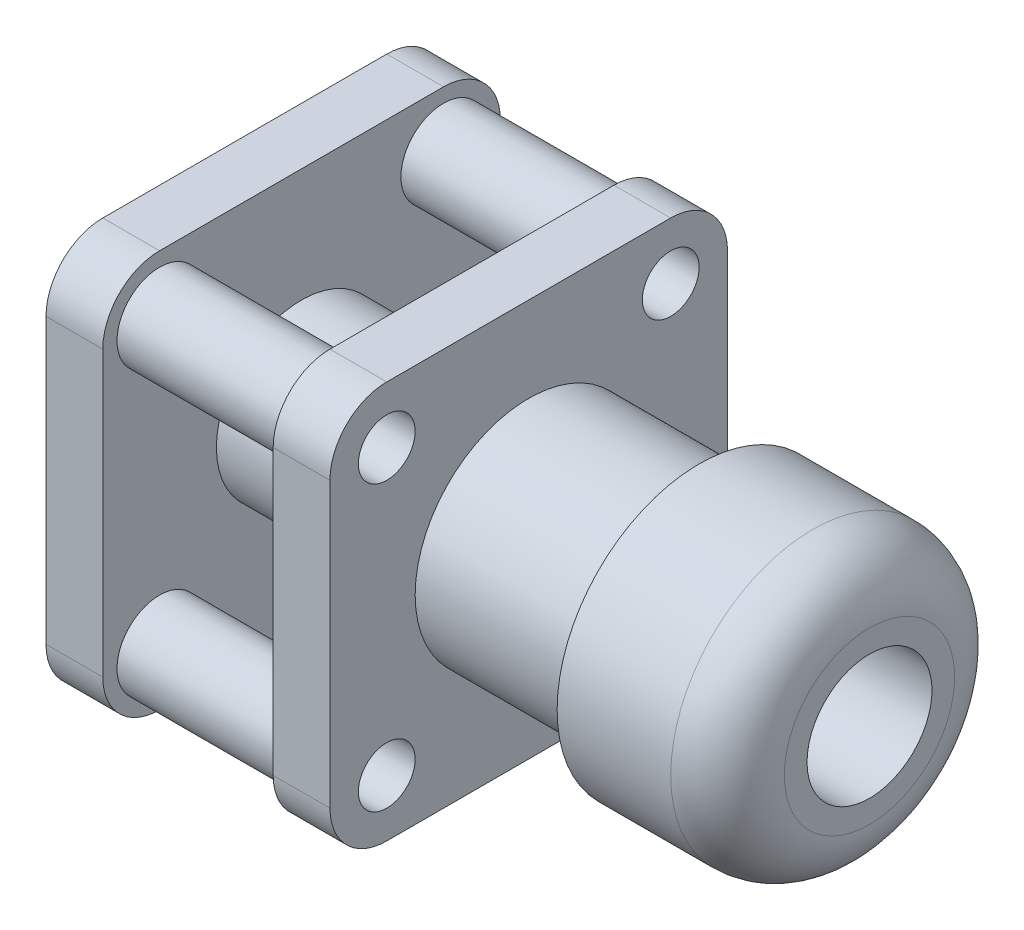
ISO-10303-21;
HEADER;
FILE_DESCRIPTION(('STEP AP214'),'2;1');
FILE_NAME('part.step','',(''),(''),'','','');
FILE_SCHEMA(('AUTOMOTIVE_DESIGN { 1 0 10303 214 1 1 1 1 }'));
ENDSEC;
DATA;
#1=APPLICATION_CONTEXT('core data for automotive mechanical design processes');
#2=APPLICATION_PROTOCOL_DEFINITION('international standard','automotive_design',2000,#1);
#3=PRODUCT_CONTEXT('',#1,'mechanical');
#4=PRODUCT('Part','Part','',(#3));
#5=PRODUCT_RELATED_PRODUCT_CATEGORY('part','',(#4));
#6=PRODUCT_DEFINITION_FORMATION('','',#4);
#7=PRODUCT_DEFINITION_CONTEXT('part definition',#1,'design');
#8=PRODUCT_DEFINITION('design','',#6,#7);
#9=PRODUCT_DEFINITION_SHAPE('','',#8);
#10=(LENGTH_UNIT() NAMED_UNIT(*) SI_UNIT(.MILLI.,.METRE.));
#11=(NAMED_UNIT(*) PLANE_ANGLE_UNIT() SI_UNIT($,.RADIAN.));
#12=(NAMED_UNIT(*) SI_UNIT($,.STERADIAN.) SOLID_ANGLE_UNIT());
#13=UNCERTAINTY_MEASURE_WITH_UNIT(LENGTH_MEASURE(1.E-05),#10,'distance_accuracy_value','');
#14=(GEOMETRIC_REPRESENTATION_CONTEXT(3) GLOBAL_UNCERTAINTY_ASSIGNED_CONTEXT((#13)) GLOBAL_UNIT_ASSIGNED_CONTEXT((#10,
#11,#12)) REPRESENTATION_CONTEXT('',''));
#15=CARTESIAN_POINT('',(0.,0.,0.));
#16=DIRECTION('',(0.,0.,1.));
#17=DIRECTION('',(1.,0.,0.));
#18=AXIS2_PLACEMENT_3D('',#15,#16,#17);
#19=CARTESIAN_POINT('',(6.88338275267597E-12,0.,0.));
#20=DIRECTION('',(-1.,0.,0.));
#21=DIRECTION('',(0.,0.,1.));
#22=AXIS2_PLACEMENT_3D('',#19,#20,#21);
#23=CYLINDRICAL_SURFACE('',#22,11.);
#24=CARTESIAN_POINT('',(110.,0.,0.));
#25=DIRECTION('',(-1.,0.,0.));
#26=DIRECTION('',(0.,0.,1.));
#27=AXIS2_PLACEMENT_3D('',#24,#25,#26);
#28=CIRCLE('',#27,11.);
#29=CARTESIAN_POINT('',(110.,0.,11.));
#30=VERTEX_POINT('',#29);
#31=EDGE_CURVE('E180',#30,#30,#28,.T.);
#32=ORIENTED_EDGE('',*,*,#31,.F.);
#33=EDGE_LOOP('',(#32));
#34=FACE_BOUND('',#33,.T.);
#35=CARTESIAN_POINT('',(0.,0.,0.));
#36=DIRECTION('',(-1.,0.,0.));
#37=DIRECTION('',(0.,0.,1.));
#38=AXIS2_PLACEMENT_3D('',#35,#36,#37);
#39=CIRCLE('',#38,11.);
#40=CARTESIAN_POINT('',(0.,0.,11.));
#41=VERTEX_POINT('',#40);
#42=EDGE_CURVE('E256',#41,#41,#39,.T.);
#43=ORIENTED_EDGE('',*,*,#42,.T.);
#44=EDGE_LOOP('',(#43));
#45=FACE_BOUND('',#44,.T.);
#46=ADVANCED_FACE('F45',(#34,#45),#23,.F.);
#47=CARTESIAN_POINT('',(0.,-11.,0.));
#48=DIRECTION('',(-1.,0.,0.));
#49=DIRECTION('',(0.,0.,1.));
#50=AXIS2_PLACEMENT_3D('',#47,#48,#49);
#51=PLANE('',#50);
#52=ORIENTED_EDGE('',*,*,#42,.F.);
#53=EDGE_LOOP('',(#52));
#54=FACE_BOUND('',#53,.T.);
#55=CARTESIAN_POINT('',(0.,-25.,25.));
#56=DIRECTION('',(-1.,0.,0.));
#57=DIRECTION('',(0.,0.,1.));
#58=AXIS2_PLACEMENT_3D('',#55,#56,#57);
#59=CIRCLE('',#58,5.);
#60=CARTESIAN_POINT('',(0.,-25.,30.));
#61=VERTEX_POINT('',#60);
#62=EDGE_CURVE('E262',#61,#61,#59,.T.);
#63=ORIENTED_EDGE('',*,*,#62,.F.);
#64=EDGE_LOOP('',(#63));
#65=FACE_BOUND('',#64,.T.);
#66=CARTESIAN_POINT('',(0.,25.,25.));
#67=DIRECTION('',(-1.,0.,0.));
#68=DIRECTION('',(0.,0.,1.));
#69=AXIS2_PLACEMENT_3D('',#66,#67,#68);
#70=CIRCLE('',#69,5.);
#71=CARTESIAN_POINT('',(0.,25.,30.));
#72=VERTEX_POINT('',#71);
#73=EDGE_CURVE('E277',#72,#72,#70,.T.);
#74=ORIENTED_EDGE('',*,*,#73,.F.);
#75=EDGE_LOOP('',(#74));
#76=FACE_BOUND('',#75,.T.);
#77=CARTESIAN_POINT('',(0.,25.,-25.));
#78=DIRECTION('',(-1.,0.,0.));
#79=DIRECTION('',(0.,0.,1.));
#80=AXIS2_PLACEMENT_3D('',#77,#78,#79);
#81=CIRCLE('',#80,5.);
#82=CARTESIAN_POINT('',(0.,25.,-20.));
#83=VERTEX_POINT('',#82);
#84=EDGE_CURVE('E281',#83,#83,#81,.T.);
#85=ORIENTED_EDGE('',*,*,#84,.F.);
#86=EDGE_LOOP('',(#85));
#87=FACE_BOUND('',#86,.T.);
#88=CARTESIAN_POINT('',(0.,-25.,-25.));
#89=DIRECTION('',(-1.,0.,0.));
#90=DIRECTION('',(0.,0.,1.));
#91=AXIS2_PLACEMENT_3D('',#88,#89,#90);
#92=CIRCLE('',#91,5.);
#93=CARTESIAN_POINT('',(0.,-25.,-20.));
#94=VERTEX_POINT('',#93);
#95=EDGE_CURVE('E269',#94,#94,#92,.T.);
#96=ORIENTED_EDGE('',*,*,#95,.F.);
#97=EDGE_LOOP('',(#96));
#98=FACE_BOUND('',#97,.T.);
#99=DIRECTION('',(0.,1.,0.));
#100=VECTOR('',#99,1.);
#101=CARTESIAN_POINT('',(0.,24.9999999999999,35.));
#102=LINE('',#101,#100);
#103=CARTESIAN_POINT('',(0.,-24.9999999999999,35.));
#104=VERTEX_POINT('',#103);
#105=CARTESIAN_POINT('',(0.,24.9999999999999,35.));
#106=VERTEX_POINT('',#105);
#107=EDGE_CURVE('E162',#104,#106,#102,.T.);
#108=ORIENTED_EDGE('',*,*,#107,.T.);
#109=CARTESIAN_POINT('',(0.,25.,25.));
#110=DIRECTION('',(-1.,0.,0.));
#111=DIRECTION('',(0.,0.,-1.));
#112=AXIS2_PLACEMENT_3D('',#109,#110,#111);
#113=CIRCLE('',#112,10.);
#114=CARTESIAN_POINT('',(0.,35.,24.9999999999999));
#115=VERTEX_POINT('',#114);
#116=EDGE_CURVE('E165',#106,#115,#113,.T.);
#117=ORIENTED_EDGE('',*,*,#116,.T.);
#118=DIRECTION('',(0.,0.,-1.));
#119=VECTOR('',#118,1.);
#120=CARTESIAN_POINT('',(0.,35.,-24.9999999999999));
#121=LINE('',#120,#119);
#122=CARTESIAN_POINT('',(0.,35.,-24.9999999999999));
#123=VERTEX_POINT('',#122);
#124=EDGE_CURVE('E169',#115,#123,#121,.T.);
#125=ORIENTED_EDGE('',*,*,#124,.T.);
#126=CARTESIAN_POINT('',(0.,25.,-25.));
#127=DIRECTION('',(-1.,0.,0.));
#128=DIRECTION('',(0.,0.,1.));
#129=AXIS2_PLACEMENT_3D('',#126,#127,#128);
#130=CIRCLE('',#129,10.);
#131=CARTESIAN_POINT('',(0.,24.9999999999999,-35.));
#132=VERTEX_POINT('',#131);
#133=EDGE_CURVE('E138',#123,#132,#130,.T.);
#134=ORIENTED_EDGE('',*,*,#133,.T.);
#135=DIRECTION('',(0.,-1.,0.));
#136=VECTOR('',#135,1.);
#137=CARTESIAN_POINT('',(0.,24.9999999999999,-35.));
#138=LINE('',#137,#136);
#139=CARTESIAN_POINT('',(0.,-24.9999999999999,-35.));
#140=VERTEX_POINT('',#139);
#141=EDGE_CURVE('E89',#132,#140,#138,.T.);
#142=ORIENTED_EDGE('',*,*,#141,.T.);
#143=CARTESIAN_POINT('',(0.,-25.,-25.));
#144=DIRECTION('',(-1.,0.,0.));
#145=DIRECTION('',(0.,0.,1.));
#146=AXIS2_PLACEMENT_3D('',#143,#144,#145);
#147=CIRCLE('',#146,10.);
#148=CARTESIAN_POINT('',(0.,-35.,-24.9999999999999));
#149=VERTEX_POINT('',#148);
#150=EDGE_CURVE('E151',#140,#149,#147,.T.);
#151=ORIENTED_EDGE('',*,*,#150,.T.);
#152=DIRECTION('',(0.,0.,1.));
#153=VECTOR('',#152,1.);
#154=CARTESIAN_POINT('',(0.,-35.,-24.9999999999999));
#155=LINE('',#154,#153);
#156=CARTESIAN_POINT('',(0.,-35.,24.9999999999999));
#157=VERTEX_POINT('',#156);
#158=EDGE_CURVE('E154',#149,#157,#155,.T.);
#159=ORIENTED_EDGE('',*,*,#158,.T.);
#160=CARTESIAN_POINT('',(0.,-25.,25.));
#161=DIRECTION('',(-1.,0.,0.));
#162=DIRECTION('',(0.,0.,1.));
#163=AXIS2_PLACEMENT_3D('',#160,#161,#162);
#164=CIRCLE('',#163,10.);
#165=EDGE_CURVE('E158',#157,#104,#164,.T.);
#166=ORIENTED_EDGE('',*,*,#165,.T.);
#167=EDGE_LOOP('',(#108,#117,#125,#134,#142,#151,#159,#166));
#168=FACE_BOUND('',#167,.T.);
#169=ADVANCED_FACE('F245',(#54,#65,#76,#87,#98,#168),#51,.T.);
#170=CARTESIAN_POINT('',(10.,-35.,0.));
#171=DIRECTION('',(1.,0.,0.));
#172=DIRECTION('',(0.,0.,-1.));
#173=AXIS2_PLACEMENT_3D('',#170,#171,#172);
#174=PLANE('',#173);
#175=CARTESIAN_POINT('',(10.,-25.,25.));
#176=DIRECTION('',(-1.,0.,0.));
#177=DIRECTION('',(0.,0.,1.));
#178=AXIS2_PLACEMENT_3D('',#175,#176,#177);
#179=CIRCLE('',#178,7.5);
#180=CARTESIAN_POINT('',(10.,-25.,32.5));
#181=VERTEX_POINT('',#180);
#182=EDGE_CURVE('E377',#181,#181,#179,.T.);
#183=ORIENTED_EDGE('',*,*,#182,.T.);
#184=EDGE_LOOP('',(#183));
#185=FACE_BOUND('',#184,.T.);
#186=CARTESIAN_POINT('',(10.,-25.,-25.));
#187=DIRECTION('',(-1.,0.,0.));
#188=DIRECTION('',(0.,0.,1.));
#189=AXIS2_PLACEMENT_3D('',#186,#187,#188);
#190=CIRCLE('',#189,7.5);
#191=CARTESIAN_POINT('',(10.,-25.,-17.5));
#192=VERTEX_POINT('',#191);
#193=EDGE_CURVE('E408',#192,#192,#190,.T.);
#194=ORIENTED_EDGE('',*,*,#193,.T.);
#195=EDGE_LOOP('',(#194));
#196=FACE_BOUND('',#195,.T.);
#197=CARTESIAN_POINT('',(10.,25.,25.));
#198=DIRECTION('',(-1.,0.,0.));
#199=DIRECTION('',(0.,0.,1.));
#200=AXIS2_PLACEMENT_3D('',#197,#198,#199);
#201=CIRCLE('',#200,7.5);
#202=CARTESIAN_POINT('',(10.,25.,32.5));
#203=VERTEX_POINT('',#202);
#204=EDGE_CURVE('E155',#203,#203,#201,.T.);
#205=ORIENTED_EDGE('',*,*,#204,.T.);
#206=EDGE_LOOP('',(#205));
#207=FACE_BOUND('',#206,.T.);
#208=CARTESIAN_POINT('',(10.,25.,-25.));
#209=DIRECTION('',(-1.,0.,0.));
#210=DIRECTION('',(0.,0.,1.));
#211=AXIS2_PLACEMENT_3D('',#208,#209,#210);
#212=CIRCLE('',#211,7.5);
#213=CARTESIAN_POINT('',(10.,25.,-17.5));
#214=VERTEX_POINT('',#213);
#215=EDGE_CURVE('E412',#214,#214,#212,.T.);
#216=ORIENTED_EDGE('',*,*,#215,.T.);
#217=EDGE_LOOP('',(#216));
#218=FACE_BOUND('',#217,.T.);
#219=CARTESIAN_POINT('',(10.,25.,25.));
#220=DIRECTION('',(-1.,0.,0.));
#221=DIRECTION('',(0.,0.,-1.));
#222=AXIS2_PLACEMENT_3D('',#219,#220,#221);
#223=CIRCLE('',#222,10.);
#224=CARTESIAN_POINT('',(10.,24.9999999999999,35.));
#225=VERTEX_POINT('',#224);
#226=CARTESIAN_POINT('',(10.,35.,24.9999999999999));
#227=VERTEX_POINT('',#226);
#228=EDGE_CURVE('E133',#225,#227,#223,.T.);
#229=ORIENTED_EDGE('',*,*,#228,.F.);
#230=DIRECTION('',(0.,1.,0.));
#231=VECTOR('',#230,1.);
#232=CARTESIAN_POINT('',(10.,24.9999999999999,35.));
#233=LINE('',#232,#231);
#234=CARTESIAN_POINT('',(10.,-24.9999999999999,35.));
#235=VERTEX_POINT('',#234);
#236=EDGE_CURVE('E429',#235,#225,#233,.T.);
#237=ORIENTED_EDGE('',*,*,#236,.F.);
#238=CARTESIAN_POINT('',(10.,-25.,25.));
#239=DIRECTION('',(-1.,0.,0.));
#240=DIRECTION('',(0.,0.,1.));
#241=AXIS2_PLACEMENT_3D('',#238,#239,#240);
#242=CIRCLE('',#241,10.);
#243=CARTESIAN_POINT('',(10.,-35.,24.9999999999999));
#244=VERTEX_POINT('',#243);
#245=EDGE_CURVE('E425',#244,#235,#242,.T.);
#246=ORIENTED_EDGE('',*,*,#245,.F.);
#247=DIRECTION('',(0.,0.,1.));
#248=VECTOR('',#247,1.);
#249=CARTESIAN_POINT('',(10.,-35.,-24.9999999999999));
#250=LINE('',#249,#248);
#251=CARTESIAN_POINT('',(10.,-35.,-24.9999999999999));
#252=VERTEX_POINT('',#251);
#253=EDGE_CURVE('E422',#252,#244,#250,.T.);
#254=ORIENTED_EDGE('',*,*,#253,.F.);
#255=CARTESIAN_POINT('',(10.,-25.,-25.));
#256=DIRECTION('',(-1.,0.,0.));
#257=DIRECTION('',(0.,0.,1.));
#258=AXIS2_PLACEMENT_3D('',#255,#256,#257);
#259=CIRCLE('',#258,10.);
#260=CARTESIAN_POINT('',(10.,-24.9999999999999,-35.));
#261=VERTEX_POINT('',#260);
#262=EDGE_CURVE('E176',#261,#252,#259,.T.);
#263=ORIENTED_EDGE('',*,*,#262,.F.);
#264=DIRECTION('',(0.,-1.,0.));
#265=VECTOR('',#264,1.);
#266=CARTESIAN_POINT('',(10.,24.9999999999999,-35.));
#267=LINE('',#266,#265);
#268=CARTESIAN_POINT('',(10.,24.9999999999999,-35.));
#269=VERTEX_POINT('',#268);
#270=EDGE_CURVE('E62',#269,#261,#267,.T.);
#271=ORIENTED_EDGE('',*,*,#270,.F.);
#272=CARTESIAN_POINT('',(10.,25.,-25.));
#273=DIRECTION('',(-1.,0.,0.));
#274=DIRECTION('',(0.,0.,1.));
#275=AXIS2_PLACEMENT_3D('',#272,#273,#274);
#276=CIRCLE('',#275,10.);
#277=CARTESIAN_POINT('',(10.,35.,-24.9999999999999));
#278=VERTEX_POINT('',#277);
#279=EDGE_CURVE('E132',#278,#269,#276,.T.);
#280=ORIENTED_EDGE('',*,*,#279,.F.);
#281=DIRECTION('',(0.,0.,-1.));
#282=VECTOR('',#281,1.);
#283=CARTESIAN_POINT('',(10.,35.,-24.9999999999999));
#284=LINE('',#283,#282);
#285=EDGE_CURVE('E120',#227,#278,#284,.T.);
#286=ORIENTED_EDGE('',*,*,#285,.F.);
#287=EDGE_LOOP('',(#229,#237,#246,#254,#263,#271,#280,#286));
#288=FACE_BOUND('',#287,.T.);
#289=CARTESIAN_POINT('',(10.,0.,0.));
#290=DIRECTION('',(-1.,0.,0.));
#291=DIRECTION('',(0.,0.,1.));
#292=AXIS2_PLACEMENT_3D('',#289,#290,#291);
#293=CIRCLE('',#292,15.);
#294=CARTESIAN_POINT('',(10.,0.,15.));
#295=VERTEX_POINT('',#294);
#296=EDGE_CURVE('E11',#295,#295,#293,.T.);
#297=ORIENTED_EDGE('',*,*,#296,.T.);
#298=EDGE_LOOP('',(#297));
#299=FACE_BOUND('',#298,.T.);
#300=ADVANCED_FACE('F142',(#185,#196,#207,#218,#288,#299),#174,.T.);
#301=CARTESIAN_POINT('',(6.88338275267597E-12,0.,0.));
#302=DIRECTION('',(-1.,0.,0.));
#303=DIRECTION('',(0.,0.,1.));
#304=AXIS2_PLACEMENT_3D('',#301,#302,#303);
#305=CYLINDRICAL_SURFACE('',#304,15.);
#306=CARTESIAN_POINT('',(40.,0.,0.));
#307=DIRECTION('',(-1.,0.,0.));
#308=DIRECTION('',(0.,0.,1.));
#309=AXIS2_PLACEMENT_3D('',#306,#307,#308);
#310=CIRCLE('',#309,15.);
#311=CARTESIAN_POINT('',(40.,0.,15.));
#312=VERTEX_POINT('',#311);
#313=EDGE_CURVE('E54',#312,#312,#310,.T.);
#314=ORIENTED_EDGE('',*,*,#313,.T.);
#315=EDGE_LOOP('',(#314));
#316=FACE_BOUND('',#315,.T.);
#317=ORIENTED_EDGE('',*,*,#296,.F.);
#318=EDGE_LOOP('',(#317));
#319=FACE_BOUND('',#318,.T.);
#320=ADVANCED_FACE('F224',(#316,#319),#305,.T.);
#321=CARTESIAN_POINT('',(40.,-15.,0.));
#322=DIRECTION('',(-1.,0.,0.));
#323=DIRECTION('',(0.,0.,1.));
#324=AXIS2_PLACEMENT_3D('',#321,#322,#323);
#325=PLANE('',#324);
#326=CARTESIAN_POINT('',(40.,-25.,25.));
#327=DIRECTION('',(-1.,0.,0.));
#328=DIRECTION('',(0.,0.,1.));
#329=AXIS2_PLACEMENT_3D('',#326,#327,#328);
#330=CIRCLE('',#329,7.5);
#331=CARTESIAN_POINT('',(40.,-25.,32.5));
#332=VERTEX_POINT('',#331);
#333=EDGE_CURVE('E289',#332,#332,#330,.T.);
#334=ORIENTED_EDGE('',*,*,#333,.F.);
#335=EDGE_LOOP('',(#334));
#336=FACE_BOUND('',#335,.T.);
#337=CARTESIAN_POINT('',(40.,-25.,-25.));
#338=DIRECTION('',(-1.,0.,0.));
#339=DIRECTION('',(0.,0.,1.));
#340=AXIS2_PLACEMENT_3D('',#337,#338,#339);
#341=CIRCLE('',#340,7.5);
#342=CARTESIAN_POINT('',(40.,-25.,-17.5));
#343=VERTEX_POINT('',#342);
#344=EDGE_CURVE('E296',#343,#343,#341,.T.);
#345=ORIENTED_EDGE('',*,*,#344,.F.);
#346=EDGE_LOOP('',(#345));
#347=FACE_BOUND('',#346,.T.);
#348=CARTESIAN_POINT('',(40.,25.,25.));
#349=DIRECTION('',(-1.,0.,0.));
#350=DIRECTION('',(0.,0.,1.));
#351=AXIS2_PLACEMENT_3D('',#348,#349,#350);
#352=CIRCLE('',#351,7.5);
#353=CARTESIAN_POINT('',(40.,25.,32.5));
#354=VERTEX_POINT('',#353);
#355=EDGE_CURVE('E304',#354,#354,#352,.T.);
#356=ORIENTED_EDGE('',*,*,#355,.F.);
#357=EDGE_LOOP('',(#356));
#358=FACE_BOUND('',#357,.T.);
#359=CARTESIAN_POINT('',(40.,25.,-25.));
#360=DIRECTION('',(-1.,0.,0.));
#361=DIRECTION('',(0.,0.,1.));
#362=AXIS2_PLACEMENT_3D('',#359,#360,#361);
#363=CIRCLE('',#362,7.5);
#364=CARTESIAN_POINT('',(40.,25.,-17.5));
#365=VERTEX_POINT('',#364);
#366=EDGE_CURVE('E300',#365,#365,#363,.T.);
#367=ORIENTED_EDGE('',*,*,#366,.F.);
#368=EDGE_LOOP('',(#367));
#369=FACE_BOUND('',#368,.T.);
#370=DIRECTION('',(0.,1.,0.));
#371=VECTOR('',#370,1.);
#372=CARTESIAN_POINT('',(40.,24.9999999999999,35.));
#373=LINE('',#372,#371);
#374=CARTESIAN_POINT('',(40.,-24.9999999999999,35.));
#375=VERTEX_POINT('',#374);
#376=CARTESIAN_POINT('',(40.,24.9999999999999,35.));
#377=VERTEX_POINT('',#376);
#378=EDGE_CURVE('E354',#375,#377,#373,.T.);
#379=ORIENTED_EDGE('',*,*,#378,.T.);
#380=CARTESIAN_POINT('',(40.,25.,25.));
#381=DIRECTION('',(-1.,0.,0.));
#382=DIRECTION('',(0.,0.,-1.));
#383=AXIS2_PLACEMENT_3D('',#380,#381,#382);
#384=CIRCLE('',#383,10.);
#385=CARTESIAN_POINT('',(40.,35.,24.9999999999999));
#386=VERTEX_POINT('',#385);
#387=EDGE_CURVE('E358',#377,#386,#384,.T.);
#388=ORIENTED_EDGE('',*,*,#387,.T.);
#389=DIRECTION('',(0.,0.,-1.));
#390=VECTOR('',#389,1.);
#391=CARTESIAN_POINT('',(40.,35.,-24.9999999999999));
#392=LINE('',#391,#390);
#393=CARTESIAN_POINT('',(40.,35.,-24.9999999999999));
#394=VERTEX_POINT('',#393);
#395=EDGE_CURVE('E362',#386,#394,#392,.T.);
#396=ORIENTED_EDGE('',*,*,#395,.T.);
#397=CARTESIAN_POINT('',(40.,25.,-25.));
#398=DIRECTION('',(-1.,0.,0.));
#399=DIRECTION('',(0.,0.,1.));
#400=AXIS2_PLACEMENT_3D('',#397,#398,#399);
#401=CIRCLE('',#400,10.);
#402=CARTESIAN_POINT('',(40.,24.9999999999999,-35.));
#403=VERTEX_POINT('',#402);
#404=EDGE_CURVE('E366',#394,#403,#401,.T.);
#405=ORIENTED_EDGE('',*,*,#404,.T.);
#406=DIRECTION('',(0.,-1.,0.));
#407=VECTOR('',#406,1.);
#408=CARTESIAN_POINT('',(40.,24.9999999999999,-35.));
#409=LINE('',#408,#407);
#410=CARTESIAN_POINT('',(40.,-24.9999999999999,-35.));
#411=VERTEX_POINT('',#410);
#412=EDGE_CURVE('E314',#403,#411,#409,.T.);
#413=ORIENTED_EDGE('',*,*,#412,.T.);
#414=CARTESIAN_POINT('',(40.,-25.,-25.));
#415=DIRECTION('',(-1.,0.,0.));
#416=DIRECTION('',(0.,0.,1.));
#417=AXIS2_PLACEMENT_3D('',#414,#415,#416);
#418=CIRCLE('',#417,10.);
#419=CARTESIAN_POINT('',(40.,-35.,-24.9999999999999));
#420=VERTEX_POINT('',#419);
#421=EDGE_CURVE('E308',#411,#420,#418,.T.);
#422=ORIENTED_EDGE('',*,*,#421,.T.);
#423=DIRECTION('',(0.,0.,1.));
#424=VECTOR('',#423,1.);
#425=CARTESIAN_POINT('',(40.,-35.,-24.9999999999999));
#426=LINE('',#425,#424);
#427=CARTESIAN_POINT('',(40.,-35.,24.9999999999999));
#428=VERTEX_POINT('',#427);
#429=EDGE_CURVE('E346',#420,#428,#426,.T.);
#430=ORIENTED_EDGE('',*,*,#429,.T.);
#431=CARTESIAN_POINT('',(40.,-25.,25.));
#432=DIRECTION('',(-1.,0.,0.));
#433=DIRECTION('',(0.,0.,1.));
#434=AXIS2_PLACEMENT_3D('',#431,#432,#433);
#435=CIRCLE('',#434,10.);
#436=EDGE_CURVE('E350',#428,#375,#435,.T.);
#437=ORIENTED_EDGE('',*,*,#436,.T.);
#438=EDGE_LOOP('',(#379,#388,#396,#405,#413,#422,#430,#437));
#439=FACE_BOUND('',#438,.T.);
#440=ORIENTED_EDGE('',*,*,#313,.F.);
#441=EDGE_LOOP('',(#440));
#442=FACE_BOUND('',#441,.T.);
#443=ADVANCED_FACE('F227',(#336,#347,#358,#369,#439,#442),#325,.T.);
#444=CARTESIAN_POINT('',(50.,-35.,0.));
#445=DIRECTION('',(1.,0.,0.));
#446=DIRECTION('',(0.,0.,-1.));
#447=AXIS2_PLACEMENT_3D('',#444,#445,#446);
#448=PLANE('',#447);
#449=CARTESIAN_POINT('',(50.,-25.,25.));
#450=DIRECTION('',(-1.,0.,0.));
#451=DIRECTION('',(0.,0.,1.));
#452=AXIS2_PLACEMENT_3D('',#449,#450,#451);
#453=CIRCLE('',#452,5.);
#454=CARTESIAN_POINT('',(50.,-25.,30.));
#455=VERTEX_POINT('',#454);
#456=EDGE_CURVE('E258',#455,#455,#453,.T.);
#457=ORIENTED_EDGE('',*,*,#456,.T.);
#458=EDGE_LOOP('',(#457));
#459=FACE_BOUND('',#458,.T.);
#460=CARTESIAN_POINT('',(50.,25.,25.));
#461=DIRECTION('',(-1.,0.,0.));
#462=DIRECTION('',(0.,0.,1.));
#463=AXIS2_PLACEMENT_3D('',#460,#461,#462);
#464=CIRCLE('',#463,5.);
#465=CARTESIAN_POINT('',(50.,25.,30.));
#466=VERTEX_POINT('',#465);
#467=EDGE_CURVE('E273',#466,#466,#464,.T.);
#468=ORIENTED_EDGE('',*,*,#467,.T.);
#469=EDGE_LOOP('',(#468));
#470=FACE_BOUND('',#469,.T.);
#471=CARTESIAN_POINT('',(50.,25.,-25.));
#472=DIRECTION('',(-1.,0.,0.));
#473=DIRECTION('',(0.,0.,1.));
#474=AXIS2_PLACEMENT_3D('',#471,#472,#473);
#475=CIRCLE('',#474,5.);
#476=CARTESIAN_POINT('',(50.,25.,-20.));
#477=VERTEX_POINT('',#476);
#478=EDGE_CURVE('E285',#477,#477,#475,.T.);
#479=ORIENTED_EDGE('',*,*,#478,.T.);
#480=EDGE_LOOP('',(#479));
#481=FACE_BOUND('',#480,.T.);
#482=CARTESIAN_POINT('',(50.,-25.,-25.));
#483=DIRECTION('',(-1.,0.,0.));
#484=DIRECTION('',(0.,0.,1.));
#485=AXIS2_PLACEMENT_3D('',#482,#483,#484);
#486=CIRCLE('',#485,5.);
#487=CARTESIAN_POINT('',(50.,-25.,-20.));
#488=VERTEX_POINT('',#487);
#489=EDGE_CURVE('E267',#488,#488,#486,.T.);
#490=ORIENTED_EDGE('',*,*,#489,.T.);
#491=EDGE_LOOP('',(#490));
#492=FACE_BOUND('',#491,.T.);
#493=CARTESIAN_POINT('',(50.,25.,25.));
#494=DIRECTION('',(-1.,0.,0.));
#495=DIRECTION('',(0.,0.,-1.));
#496=AXIS2_PLACEMENT_3D('',#493,#494,#495);
#497=CIRCLE('',#496,10.);
#498=CARTESIAN_POINT('',(50.,24.9999999999999,35.));
#499=VERTEX_POINT('',#498);
#500=CARTESIAN_POINT('',(50.,35.,24.9999999999999));
#501=VERTEX_POINT('',#500);
#502=EDGE_CURVE('E326',#499,#501,#497,.T.);
#503=ORIENTED_EDGE('',*,*,#502,.F.);
#504=DIRECTION('',(0.,1.,0.));
#505=VECTOR('',#504,1.);
#506=CARTESIAN_POINT('',(50.,24.9999999999999,35.));
#507=LINE('',#506,#505);
#508=CARTESIAN_POINT('',(50.,-24.9999999999999,35.));
#509=VERTEX_POINT('',#508);
#510=EDGE_CURVE('E322',#509,#499,#507,.T.);
#511=ORIENTED_EDGE('',*,*,#510,.F.);
#512=CARTESIAN_POINT('',(50.,-25.,25.));
#513=DIRECTION('',(-1.,0.,0.));
#514=DIRECTION('',(0.,0.,1.));
#515=AXIS2_PLACEMENT_3D('',#512,#513,#514);
#516=CIRCLE('',#515,10.);
#517=CARTESIAN_POINT('',(50.,-35.,24.9999999999999));
#518=VERTEX_POINT('',#517);
#519=EDGE_CURVE('E318',#518,#509,#516,.T.);
#520=ORIENTED_EDGE('',*,*,#519,.F.);
#521=DIRECTION('',(0.,0.,1.));
#522=VECTOR('',#521,1.);
#523=CARTESIAN_POINT('',(50.,-35.,-24.9999999999999));
#524=LINE('',#523,#522);
#525=CARTESIAN_POINT('',(50.,-35.,-24.9999999999999));
#526=VERTEX_POINT('',#525);
#527=EDGE_CURVE('E313',#526,#518,#524,.T.);
#528=ORIENTED_EDGE('',*,*,#527,.F.);
#529=CARTESIAN_POINT('',(50.,-25.,-25.));
#530=DIRECTION('',(-1.,0.,0.));
#531=DIRECTION('',(0.,0.,1.));
#532=AXIS2_PLACEMENT_3D('',#529,#530,#531);
#533=CIRCLE('',#532,10.);
#534=CARTESIAN_POINT('',(50.,-24.9999999999999,-35.));
#535=VERTEX_POINT('',#534);
#536=EDGE_CURVE('E309',#535,#526,#533,.T.);
#537=ORIENTED_EDGE('',*,*,#536,.F.);
#538=DIRECTION('',(0.,-1.,0.));
#539=VECTOR('',#538,1.);
#540=CARTESIAN_POINT('',(50.,24.9999999999999,-35.));
#541=LINE('',#540,#539);
#542=CARTESIAN_POINT('',(50.,24.9999999999999,-35.));
#543=VERTEX_POINT('',#542);
#544=EDGE_CURVE('E338',#543,#535,#541,.T.);
#545=ORIENTED_EDGE('',*,*,#544,.F.);
#546=CARTESIAN_POINT('',(50.,25.,-25.));
#547=DIRECTION('',(-1.,0.,0.));
#548=DIRECTION('',(0.,0.,1.));
#549=AXIS2_PLACEMENT_3D('',#546,#547,#548);
#550=CIRCLE('',#549,10.);
#551=CARTESIAN_POINT('',(50.,35.,-24.9999999999999));
#552=VERTEX_POINT('',#551);
#553=EDGE_CURVE('E334',#552,#543,#550,.T.);
#554=ORIENTED_EDGE('',*,*,#553,.F.);
#555=DIRECTION('',(0.,0.,-1.));
#556=VECTOR('',#555,1.);
#557=CARTESIAN_POINT('',(50.,35.,-24.9999999999999));
#558=LINE('',#557,#556);
#559=EDGE_CURVE('E330',#501,#552,#558,.T.);
#560=ORIENTED_EDGE('',*,*,#559,.F.);
#561=EDGE_LOOP('',(#503,#511,#520,#528,#537,#545,#554,#560));
#562=FACE_BOUND('',#561,.T.);
#563=CARTESIAN_POINT('',(50.,0.,0.));
#564=DIRECTION('',(-1.,0.,0.));
#565=DIRECTION('',(0.,0.,1.));
#566=AXIS2_PLACEMENT_3D('',#563,#564,#565);
#567=CIRCLE('',#566,20.);
#568=CARTESIAN_POINT('',(50.,0.,20.));
#569=VERTEX_POINT('',#568);
#570=EDGE_CURVE('E217',#569,#569,#567,.T.);
#571=ORIENTED_EDGE('',*,*,#570,.T.);
#572=EDGE_LOOP('',(#571));
#573=FACE_BOUND('',#572,.T.);
#574=ADVANCED_FACE('F229',(#459,#470,#481,#492,#562,#573),#448,.T.);
#575=CARTESIAN_POINT('',(6.88338275267597E-12,0.,0.));
#576=DIRECTION('',(-1.,0.,0.));
#577=DIRECTION('',(0.,0.,1.));
#578=AXIS2_PLACEMENT_3D('',#575,#576,#577);
#579=CYLINDRICAL_SURFACE('',#578,20.);
#580=CARTESIAN_POINT('',(80.,0.,0.));
#581=DIRECTION('',(-1.,0.,0.));
#582=DIRECTION('',(0.,0.,1.));
#583=AXIS2_PLACEMENT_3D('',#580,#581,#582);
#584=CIRCLE('',#583,20.);
#585=CARTESIAN_POINT('',(80.,0.,20.));
#586=VERTEX_POINT('',#585);
#587=EDGE_CURVE('E213',#586,#586,#584,.T.);
#588=ORIENTED_EDGE('',*,*,#587,.T.);
#589=EDGE_LOOP('',(#588));
#590=FACE_BOUND('',#589,.T.);
#591=ORIENTED_EDGE('',*,*,#570,.F.);
#592=EDGE_LOOP('',(#591));
#593=FACE_BOUND('',#592,.T.);
#594=ADVANCED_FACE('F237',(#590,#593),#579,.T.);
#595=CARTESIAN_POINT('',(80.,-20.,0.));
#596=DIRECTION('',(-1.,0.,0.));
#597=DIRECTION('',(0.,0.,1.));
#598=AXIS2_PLACEMENT_3D('',#595,#596,#597);
#599=PLANE('',#598);
#600=CARTESIAN_POINT('',(80.,0.,0.));
#601=DIRECTION('',(-1.,0.,0.));
#602=DIRECTION('',(0.,0.,1.));
#603=AXIS2_PLACEMENT_3D('',#600,#601,#602);
#604=CIRCLE('',#603,25.);
#605=CARTESIAN_POINT('',(80.,0.,25.));
#606=VERTEX_POINT('',#605);
#607=EDGE_CURVE('E209',#606,#606,#604,.T.);
#608=ORIENTED_EDGE('',*,*,#607,.T.);
#609=EDGE_LOOP('',(#608));
#610=FACE_BOUND('',#609,.T.);
#611=ORIENTED_EDGE('',*,*,#587,.F.);
#612=EDGE_LOOP('',(#611));
#613=FACE_BOUND('',#612,.T.);
#614=ADVANCED_FACE('F488',(#610,#613),#599,.T.);
#615=CARTESIAN_POINT('',(6.88338275267597E-12,0.,0.));
#616=DIRECTION('',(-1.,0.,0.));
#617=DIRECTION('',(0.,0.,1.));
#618=AXIS2_PLACEMENT_3D('',#615,#616,#617);
#619=CYLINDRICAL_SURFACE('',#618,25.);
#620=CARTESIAN_POINT('',(99.9999999999999,0.,0.));
#621=DIRECTION('',(-1.,0.,0.));
#622=DIRECTION('',(0.,0.,1.));
#623=AXIS2_PLACEMENT_3D('',#620,#621,#622);
#624=CIRCLE('',#623,25.);
#625=CARTESIAN_POINT('',(99.9999999999999,0.,25.));
#626=VERTEX_POINT('',#625);
#627=EDGE_CURVE('E205',#626,#626,#624,.T.);
#628=ORIENTED_EDGE('',*,*,#627,.T.);
#629=EDGE_LOOP('',(#628));
#630=FACE_BOUND('',#629,.T.);
#631=ORIENTED_EDGE('',*,*,#607,.F.);
#632=EDGE_LOOP('',(#631));
#633=FACE_BOUND('',#632,.T.);
#634=ADVANCED_FACE('F484',(#630,#633),#619,.T.);
#635=CARTESIAN_POINT('',(100.,0.,0.));
#636=DIRECTION('',(-1.,0.,0.));
#637=DIRECTION('',(0.,0.,1.));
#638=AXIS2_PLACEMENT_3D('',#635,#636,#637);
#639=TOROIDAL_SURFACE('',#638,15.,10.);
#640=CARTESIAN_POINT('',(110.,0.,0.));
#641=DIRECTION('',(-1.,0.,0.));
#642=DIRECTION('',(0.,0.,1.));
#643=AXIS2_PLACEMENT_3D('',#640,#641,#642);
#644=CIRCLE('',#643,15.);
#645=CARTESIAN_POINT('',(110.,0.,15.));
#646=VERTEX_POINT('',#645);
#647=EDGE_CURVE('E201',#646,#646,#644,.T.);
#648=ORIENTED_EDGE('',*,*,#647,.T.);
#649=EDGE_LOOP('',(#648));
#650=FACE_BOUND('',#649,.T.);
#651=ORIENTED_EDGE('',*,*,#627,.F.);
#652=EDGE_LOOP('',(#651));
#653=FACE_BOUND('',#652,.T.);
#654=ADVANCED_FACE('F480',(#650,#653),#639,.T.);
#655=CARTESIAN_POINT('',(110.,-14.9999999999999,0.));
#656=DIRECTION('',(1.,0.,0.));
#657=DIRECTION('',(0.,0.,-1.));
#658=AXIS2_PLACEMENT_3D('',#655,#656,#657);
#659=PLANE('',#658);
#660=ORIENTED_EDGE('',*,*,#31,.T.);
#661=EDGE_LOOP('',(#660));
#662=FACE_BOUND('',#661,.T.);
#663=ORIENTED_EDGE('',*,*,#647,.F.);
#664=EDGE_LOOP('',(#663));
#665=FACE_BOUND('',#664,.T.);
#666=ADVANCED_FACE('F473',(#662,#665),#659,.T.);
#667=CARTESIAN_POINT('',(10.,-25.,25.));
#668=DIRECTION('',(-1.,0.,0.));
#669=DIRECTION('',(0.,0.,1.));
#670=AXIS2_PLACEMENT_3D('',#667,#668,#669);
#671=CYLINDRICAL_SURFACE('',#670,10.);
#672=ORIENTED_EDGE('',*,*,#165,.F.);
#673=DIRECTION('',(-1.,0.,0.));
#674=VECTOR('',#673,1.);
#675=CARTESIAN_POINT('',(10.,-35.,24.9999999999999));
#676=LINE('',#675,#674);
#677=EDGE_CURVE('E192',#244,#157,#676,.T.);
#678=ORIENTED_EDGE('',*,*,#677,.F.);
#679=ORIENTED_EDGE('',*,*,#245,.T.);
#680=DIRECTION('',(-1.,0.,0.));
#681=VECTOR('',#680,1.);
#682=CARTESIAN_POINT('',(10.,-24.9999999999999,35.));
#683=LINE('',#682,#681);
#684=EDGE_CURVE('E189',#235,#104,#683,.T.);
#685=ORIENTED_EDGE('',*,*,#684,.T.);
#686=EDGE_LOOP('',(#672,#678,#679,#685));
#687=FACE_BOUND('',#686,.T.);
#688=ADVANCED_FACE('F442',(#687),#671,.T.);
#689=CARTESIAN_POINT('',(10.,25.,25.));
#690=DIRECTION('',(-1.,0.,0.));
#691=DIRECTION('',(0.,0.,1.));
#692=AXIS2_PLACEMENT_3D('',#689,#690,#691);
#693=CYLINDRICAL_SURFACE('',#692,10.);
#694=ORIENTED_EDGE('',*,*,#116,.F.);
#695=DIRECTION('',(-1.,0.,0.));
#696=VECTOR('',#695,1.);
#697=CARTESIAN_POINT('',(10.,24.9999999999999,35.));
#698=LINE('',#697,#696);
#699=EDGE_CURVE('E185',#225,#106,#698,.T.);
#700=ORIENTED_EDGE('',*,*,#699,.F.);
#701=ORIENTED_EDGE('',*,*,#228,.T.);
#702=DIRECTION('',(-1.,0.,0.));
#703=VECTOR('',#702,1.);
#704=CARTESIAN_POINT('',(10.,35.,24.9999999999999));
#705=LINE('',#704,#703);
#706=EDGE_CURVE('E126',#227,#115,#705,.T.);
#707=ORIENTED_EDGE('',*,*,#706,.T.);
#708=EDGE_LOOP('',(#694,#700,#701,#707));
#709=FACE_BOUND('',#708,.T.);
#710=ADVANCED_FACE('F435',(#709),#693,.T.);
#711=CARTESIAN_POINT('',(10.,25.,-25.));
#712=DIRECTION('',(-1.,0.,0.));
#713=DIRECTION('',(0.,0.,1.));
#714=AXIS2_PLACEMENT_3D('',#711,#712,#713);
#715=CYLINDRICAL_SURFACE('',#714,10.);
#716=ORIENTED_EDGE('',*,*,#133,.F.);
#717=DIRECTION('',(-1.,0.,0.));
#718=VECTOR('',#717,1.);
#719=CARTESIAN_POINT('',(10.,35.,-24.9999999999999));
#720=LINE('',#719,#718);
#721=EDGE_CURVE('E123',#278,#123,#720,.T.);
#722=ORIENTED_EDGE('',*,*,#721,.F.);
#723=ORIENTED_EDGE('',*,*,#279,.T.);
#724=DIRECTION('',(-1.,0.,0.));
#725=VECTOR('',#724,1.);
#726=CARTESIAN_POINT('',(10.,24.9999999999999,-35.));
#727=LINE('',#726,#725);
#728=EDGE_CURVE('E140',#269,#132,#727,.T.);
#729=ORIENTED_EDGE('',*,*,#728,.T.);
#730=EDGE_LOOP('',(#716,#722,#723,#729));
#731=FACE_BOUND('',#730,.T.);
#732=ADVANCED_FACE('F137',(#731),#715,.T.);
#733=CARTESIAN_POINT('',(10.,-25.,-25.));
#734=DIRECTION('',(-1.,0.,0.));
#735=DIRECTION('',(0.,0.,1.));
#736=AXIS2_PLACEMENT_3D('',#733,#734,#735);
#737=CYLINDRICAL_SURFACE('',#736,10.);
#738=ORIENTED_EDGE('',*,*,#150,.F.);
#739=DIRECTION('',(-1.,0.,0.));
#740=VECTOR('',#739,1.);
#741=CARTESIAN_POINT('',(10.,-24.9999999999999,-35.));
#742=LINE('',#741,#740);
#743=EDGE_CURVE('E177',#261,#140,#742,.T.);
#744=ORIENTED_EDGE('',*,*,#743,.F.);
#745=ORIENTED_EDGE('',*,*,#262,.T.);
#746=DIRECTION('',(-1.,0.,0.));
#747=VECTOR('',#746,1.);
#748=CARTESIAN_POINT('',(10.,-35.,-24.9999999999999));
#749=LINE('',#748,#747);
#750=EDGE_CURVE('E101',#252,#149,#749,.T.);
#751=ORIENTED_EDGE('',*,*,#750,.T.);
#752=EDGE_LOOP('',(#738,#744,#745,#751));
#753=FACE_BOUND('',#752,.T.);
#754=ADVANCED_FACE('F447',(#753),#737,.T.);
#755=CARTESIAN_POINT('',(10.,-35.,-24.9999999999999));
#756=DIRECTION('',(0.,-1.,0.));
#757=DIRECTION('',(0.,0.,-1.));
#758=AXIS2_PLACEMENT_3D('',#755,#756,#757);
#759=PLANE('',#758);
#760=ORIENTED_EDGE('',*,*,#253,.T.);
#761=ORIENTED_EDGE('',*,*,#677,.T.);
#762=ORIENTED_EDGE('',*,*,#158,.F.);
#763=ORIENTED_EDGE('',*,*,#750,.F.);
#764=EDGE_LOOP('',(#760,#761,#762,#763));
#765=FACE_BOUND('',#764,.T.);
#766=ADVANCED_FACE('F444',(#765),#759,.T.);
#767=CARTESIAN_POINT('',(10.,24.9999999999999,35.));
#768=DIRECTION('',(0.,0.,1.));
#769=DIRECTION('',(0.,-1.,0.));
#770=AXIS2_PLACEMENT_3D('',#767,#768,#769);
#771=PLANE('',#770);
#772=ORIENTED_EDGE('',*,*,#236,.T.);
#773=ORIENTED_EDGE('',*,*,#699,.T.);
#774=ORIENTED_EDGE('',*,*,#107,.F.);
#775=ORIENTED_EDGE('',*,*,#684,.F.);
#776=EDGE_LOOP('',(#772,#773,#774,#775));
#777=FACE_BOUND('',#776,.T.);
#778=ADVANCED_FACE('F459',(#777),#771,.T.);
#779=CARTESIAN_POINT('',(10.,35.,-24.9999999999999));
#780=DIRECTION('',(0.,1.,0.));
#781=DIRECTION('',(0.,0.,1.));
#782=AXIS2_PLACEMENT_3D('',#779,#780,#781);
#783=PLANE('',#782);
#784=ORIENTED_EDGE('',*,*,#285,.T.);
#785=ORIENTED_EDGE('',*,*,#721,.T.);
#786=ORIENTED_EDGE('',*,*,#124,.F.);
#787=ORIENTED_EDGE('',*,*,#706,.F.);
#788=EDGE_LOOP('',(#784,#785,#786,#787));
#789=FACE_BOUND('',#788,.T.);
#790=ADVANCED_FACE('F122',(#789),#783,.T.);
#791=CARTESIAN_POINT('',(10.,24.9999999999999,-35.));
#792=DIRECTION('',(0.,0.,-1.));
#793=DIRECTION('',(-1.,0.,0.));
#794=AXIS2_PLACEMENT_3D('',#791,#792,#793);
#795=PLANE('',#794);
#796=ORIENTED_EDGE('',*,*,#270,.T.);
#797=ORIENTED_EDGE('',*,*,#743,.T.);
#798=ORIENTED_EDGE('',*,*,#141,.F.);
#799=ORIENTED_EDGE('',*,*,#728,.F.);
#800=EDGE_LOOP('',(#796,#797,#798,#799));
#801=FACE_BOUND('',#800,.T.);
#802=ADVANCED_FACE('F448',(#801),#795,.T.);
#803=CARTESIAN_POINT('',(50.,-25.,25.));
#804=DIRECTION('',(-1.,0.,0.));
#805=DIRECTION('',(0.,0.,1.));
#806=AXIS2_PLACEMENT_3D('',#803,#804,#805);
#807=CYLINDRICAL_SURFACE('',#806,10.);
#808=ORIENTED_EDGE('',*,*,#436,.F.);
#809=DIRECTION('',(-1.,0.,0.));
#810=VECTOR('',#809,1.);
#811=CARTESIAN_POINT('',(50.,-35.,24.9999999999999));
#812=LINE('',#811,#810);
#813=EDGE_CURVE('E398',#518,#428,#812,.T.);
#814=ORIENTED_EDGE('',*,*,#813,.F.);
#815=ORIENTED_EDGE('',*,*,#519,.T.);
#816=DIRECTION('',(-1.,0.,0.));
#817=VECTOR('',#816,1.);
#818=CARTESIAN_POINT('',(50.,-24.9999999999999,35.));
#819=LINE('',#818,#817);
#820=EDGE_CURVE('E394',#509,#375,#819,.T.);
#821=ORIENTED_EDGE('',*,*,#820,.T.);
#822=EDGE_LOOP('',(#808,#814,#815,#821));
#823=FACE_BOUND('',#822,.T.);
#824=ADVANCED_FACE('F450',(#823),#807,.T.);
#825=CARTESIAN_POINT('',(50.,25.,25.));
#826=DIRECTION('',(-1.,0.,0.));
#827=DIRECTION('',(0.,0.,1.));
#828=AXIS2_PLACEMENT_3D('',#825,#826,#827);
#829=CYLINDRICAL_SURFACE('',#828,10.);
#830=ORIENTED_EDGE('',*,*,#387,.F.);
#831=DIRECTION('',(-1.,0.,0.));
#832=VECTOR('',#831,1.);
#833=CARTESIAN_POINT('',(50.,24.9999999999999,35.));
#834=LINE('',#833,#832);
#835=EDGE_CURVE('E390',#499,#377,#834,.T.);
#836=ORIENTED_EDGE('',*,*,#835,.F.);
#837=ORIENTED_EDGE('',*,*,#502,.T.);
#838=DIRECTION('',(-1.,0.,0.));
#839=VECTOR('',#838,1.);
#840=CARTESIAN_POINT('',(50.,35.,24.9999999999999));
#841=LINE('',#840,#839);
#842=EDGE_CURVE('E386',#501,#386,#841,.T.);
#843=ORIENTED_EDGE('',*,*,#842,.T.);
#844=EDGE_LOOP('',(#830,#836,#837,#843));
#845=FACE_BOUND('',#844,.T.);
#846=ADVANCED_FACE('F456',(#845),#829,.T.);
#847=CARTESIAN_POINT('',(50.,25.,-25.));
#848=DIRECTION('',(-1.,0.,0.));
#849=DIRECTION('',(0.,0.,1.));
#850=AXIS2_PLACEMENT_3D('',#847,#848,#849);
#851=CYLINDRICAL_SURFACE('',#850,10.);
#852=ORIENTED_EDGE('',*,*,#404,.F.);
#853=DIRECTION('',(-1.,0.,0.));
#854=VECTOR('',#853,1.);
#855=CARTESIAN_POINT('',(50.,35.,-24.9999999999999));
#856=LINE('',#855,#854);
#857=EDGE_CURVE('E382',#552,#394,#856,.T.);
#858=ORIENTED_EDGE('',*,*,#857,.F.);
#859=ORIENTED_EDGE('',*,*,#553,.T.);
#860=DIRECTION('',(-1.,0.,0.));
#861=VECTOR('',#860,1.);
#862=CARTESIAN_POINT('',(50.,24.9999999999999,-35.));
#863=LINE('',#862,#861);
#864=EDGE_CURVE('E378',#543,#403,#863,.T.);
#865=ORIENTED_EDGE('',*,*,#864,.T.);
#866=EDGE_LOOP('',(#852,#858,#859,#865));
#867=FACE_BOUND('',#866,.T.);
#868=ADVANCED_FACE('F604',(#867),#851,.T.);
#869=CARTESIAN_POINT('',(50.,-25.,-25.));
#870=DIRECTION('',(-1.,0.,0.));
#871=DIRECTION('',(0.,0.,1.));
#872=AXIS2_PLACEMENT_3D('',#869,#870,#871);
#873=CYLINDRICAL_SURFACE('',#872,10.);
#874=ORIENTED_EDGE('',*,*,#421,.F.);
#875=DIRECTION('',(-1.,0.,0.));
#876=VECTOR('',#875,1.);
#877=CARTESIAN_POINT('',(50.,-24.9999999999999,-35.));
#878=LINE('',#877,#876);
#879=EDGE_CURVE('E373',#535,#411,#878,.T.);
#880=ORIENTED_EDGE('',*,*,#879,.F.);
#881=ORIENTED_EDGE('',*,*,#536,.T.);
#882=DIRECTION('',(-1.,0.,0.));
#883=VECTOR('',#882,1.);
#884=CARTESIAN_POINT('',(50.,-35.,-24.9999999999999));
#885=LINE('',#884,#883);
#886=EDGE_CURVE('E342',#526,#420,#885,.T.);
#887=ORIENTED_EDGE('',*,*,#886,.T.);
#888=EDGE_LOOP('',(#874,#880,#881,#887));
#889=FACE_BOUND('',#888,.T.);
#890=ADVANCED_FACE('F463',(#889),#873,.T.);
#891=CARTESIAN_POINT('',(50.,-35.,-24.9999999999999));
#892=DIRECTION('',(0.,-1.,0.));
#893=DIRECTION('',(0.,0.,-1.));
#894=AXIS2_PLACEMENT_3D('',#891,#892,#893);
#895=PLANE('',#894);
#896=ORIENTED_EDGE('',*,*,#527,.T.);
#897=ORIENTED_EDGE('',*,*,#813,.T.);
#898=ORIENTED_EDGE('',*,*,#429,.F.);
#899=ORIENTED_EDGE('',*,*,#886,.F.);
#900=EDGE_LOOP('',(#896,#897,#898,#899));
#901=FACE_BOUND('',#900,.T.);
#902=ADVANCED_FACE('F623',(#901),#895,.T.);
#903=CARTESIAN_POINT('',(50.,24.9999999999999,35.));
#904=DIRECTION('',(0.,0.,1.));
#905=DIRECTION('',(0.,-1.,0.));
#906=AXIS2_PLACEMENT_3D('',#903,#904,#905);
#907=PLANE('',#906);
#908=ORIENTED_EDGE('',*,*,#510,.T.);
#909=ORIENTED_EDGE('',*,*,#835,.T.);
#910=ORIENTED_EDGE('',*,*,#378,.F.);
#911=ORIENTED_EDGE('',*,*,#820,.F.);
#912=EDGE_LOOP('',(#908,#909,#910,#911));
#913=FACE_BOUND('',#912,.T.);
#914=ADVANCED_FACE('F632',(#913),#907,.T.);
#915=CARTESIAN_POINT('',(50.,35.,-24.9999999999999));
#916=DIRECTION('',(0.,1.,0.));
#917=DIRECTION('',(0.,0.,1.));
#918=AXIS2_PLACEMENT_3D('',#915,#916,#917);
#919=PLANE('',#918);
#920=ORIENTED_EDGE('',*,*,#559,.T.);
#921=ORIENTED_EDGE('',*,*,#857,.T.);
#922=ORIENTED_EDGE('',*,*,#395,.F.);
#923=ORIENTED_EDGE('',*,*,#842,.F.);
#924=EDGE_LOOP('',(#920,#921,#922,#923));
#925=FACE_BOUND('',#924,.T.);
#926=ADVANCED_FACE('F641',(#925),#919,.T.);
#927=CARTESIAN_POINT('',(50.,24.9999999999999,-35.));
#928=DIRECTION('',(0.,0.,-1.));
#929=DIRECTION('',(-1.,0.,0.));
#930=AXIS2_PLACEMENT_3D('',#927,#928,#929);
#931=PLANE('',#930);
#932=ORIENTED_EDGE('',*,*,#544,.T.);
#933=ORIENTED_EDGE('',*,*,#879,.T.);
#934=ORIENTED_EDGE('',*,*,#412,.F.);
#935=ORIENTED_EDGE('',*,*,#864,.F.);
#936=EDGE_LOOP('',(#932,#933,#934,#935));
#937=FACE_BOUND('',#936,.T.);
#938=ADVANCED_FACE('F651',(#937),#931,.T.);
#939=CARTESIAN_POINT('',(50.,25.,-25.));
#940=DIRECTION('',(-1.,0.,0.));
#941=DIRECTION('',(0.,0.,1.));
#942=AXIS2_PLACEMENT_3D('',#939,#940,#941);
#943=CYLINDRICAL_SURFACE('',#942,5.);
#944=ORIENTED_EDGE('',*,*,#478,.F.);
#945=EDGE_LOOP('',(#944));
#946=FACE_BOUND('',#945,.T.);
#947=ORIENTED_EDGE('',*,*,#84,.T.);
#948=EDGE_LOOP('',(#947));
#949=FACE_BOUND('',#948,.T.);
#950=ADVANCED_FACE('F661',(#946,#949),#943,.F.);
#951=CARTESIAN_POINT('',(50.,25.,-25.));
#952=DIRECTION('',(-1.,0.,0.));
#953=DIRECTION('',(0.,0.,1.));
#954=AXIS2_PLACEMENT_3D('',#951,#952,#953);
#955=CYLINDRICAL_SURFACE('',#954,7.5);
#956=ORIENTED_EDGE('',*,*,#215,.F.);
#957=EDGE_LOOP('',(#956));
#958=FACE_BOUND('',#957,.T.);
#959=ORIENTED_EDGE('',*,*,#366,.T.);
#960=EDGE_LOOP('',(#959));
#961=FACE_BOUND('',#960,.T.);
#962=ADVANCED_FACE('F691',(#958,#961),#955,.T.);
#963=CARTESIAN_POINT('',(50.,25.,25.));
#964=DIRECTION('',(-1.,0.,0.));
#965=DIRECTION('',(0.,0.,1.));
#966=AXIS2_PLACEMENT_3D('',#963,#964,#965);
#967=CYLINDRICAL_SURFACE('',#966,5.);
#968=ORIENTED_EDGE('',*,*,#467,.F.);
#969=EDGE_LOOP('',(#968));
#970=FACE_BOUND('',#969,.T.);
#971=ORIENTED_EDGE('',*,*,#73,.T.);
#972=EDGE_LOOP('',(#971));
#973=FACE_BOUND('',#972,.T.);
#974=ADVANCED_FACE('F697',(#970,#973),#967,.F.);
#975=CARTESIAN_POINT('',(50.,25.,25.));
#976=DIRECTION('',(-1.,0.,0.));
#977=DIRECTION('',(0.,0.,1.));
#978=AXIS2_PLACEMENT_3D('',#975,#976,#977);
#979=CYLINDRICAL_SURFACE('',#978,7.5);
#980=ORIENTED_EDGE('',*,*,#204,.F.);
#981=EDGE_LOOP('',(#980));
#982=FACE_BOUND('',#981,.T.);
#983=ORIENTED_EDGE('',*,*,#355,.T.);
#984=EDGE_LOOP('',(#983));
#985=FACE_BOUND('',#984,.T.);
#986=ADVANCED_FACE('F700',(#982,#985),#979,.T.);
#987=CARTESIAN_POINT('',(50.,-25.,-25.));
#988=DIRECTION('',(-1.,0.,0.));
#989=DIRECTION('',(0.,0.,1.));
#990=AXIS2_PLACEMENT_3D('',#987,#988,#989);
#991=CYLINDRICAL_SURFACE('',#990,5.);
#992=ORIENTED_EDGE('',*,*,#489,.F.);
#993=EDGE_LOOP('',(#992));
#994=FACE_BOUND('',#993,.T.);
#995=ORIENTED_EDGE('',*,*,#95,.T.);
#996=EDGE_LOOP('',(#995));
#997=FACE_BOUND('',#996,.T.);
#998=ADVANCED_FACE('F707',(#994,#997),#991,.F.);
#999=CARTESIAN_POINT('',(50.,-25.,-25.));
#1000=DIRECTION('',(-1.,0.,0.));
#1001=DIRECTION('',(0.,0.,1.));
#1002=AXIS2_PLACEMENT_3D('',#999,#1000,#1001);
#1003=CYLINDRICAL_SURFACE('',#1002,7.5);
#1004=ORIENTED_EDGE('',*,*,#193,.F.);
#1005=EDGE_LOOP('',(#1004));
#1006=FACE_BOUND('',#1005,.T.);
#1007=ORIENTED_EDGE('',*,*,#344,.T.);
#1008=EDGE_LOOP('',(#1007));
#1009=FACE_BOUND('',#1008,.T.);
#1010=ADVANCED_FACE('F710',(#1006,#1009),#1003,.T.);
#1011=CARTESIAN_POINT('',(50.,-25.,25.));
#1012=DIRECTION('',(-1.,0.,0.));
#1013=DIRECTION('',(0.,0.,1.));
#1014=AXIS2_PLACEMENT_3D('',#1011,#1012,#1013);
#1015=CYLINDRICAL_SURFACE('',#1014,5.);
#1016=ORIENTED_EDGE('',*,*,#456,.F.);
#1017=EDGE_LOOP('',(#1016));
#1018=FACE_BOUND('',#1017,.T.);
#1019=ORIENTED_EDGE('',*,*,#62,.T.);
#1020=EDGE_LOOP('',(#1019));
#1021=FACE_BOUND('',#1020,.T.);
#1022=ADVANCED_FACE('F717',(#1018,#1021),#1015,.F.);
#1023=CARTESIAN_POINT('',(50.,-25.,25.));
#1024=DIRECTION('',(-1.,0.,0.));
#1025=DIRECTION('',(0.,0.,1.));
#1026=AXIS2_PLACEMENT_3D('',#1023,#1024,#1025);
#1027=CYLINDRICAL_SURFACE('',#1026,7.5);
#1028=ORIENTED_EDGE('',*,*,#182,.F.);
#1029=EDGE_LOOP('',(#1028));
#1030=FACE_BOUND('',#1029,.T.);
#1031=ORIENTED_EDGE('',*,*,#333,.T.);
#1032=EDGE_LOOP('',(#1031));
#1033=FACE_BOUND('',#1032,.T.);
#1034=ADVANCED_FACE('F719',(#1030,#1033),#1027,.T.);
#1035=CLOSED_SHELL('',(#46,#169,#300,#320,#443,#574,#594,#614,#634,#654,#666,#688,#710,#732,
#754,#766,#778,#790,#802,#824,#846,#868,#890,#902,#914,#926,#938,#950,#962,#974,#986,#998,#1010,
#1022,#1034));
#1036=MANIFOLD_SOLID_BREP('B2',#1035);
#1037=ADVANCED_BREP_SHAPE_REPRESENTATION('',(#18,#1036),#14);
#1038=SHAPE_DEFINITION_REPRESENTATION(#9,#1037);
ENDSEC;
END-ISO-10303-21;
